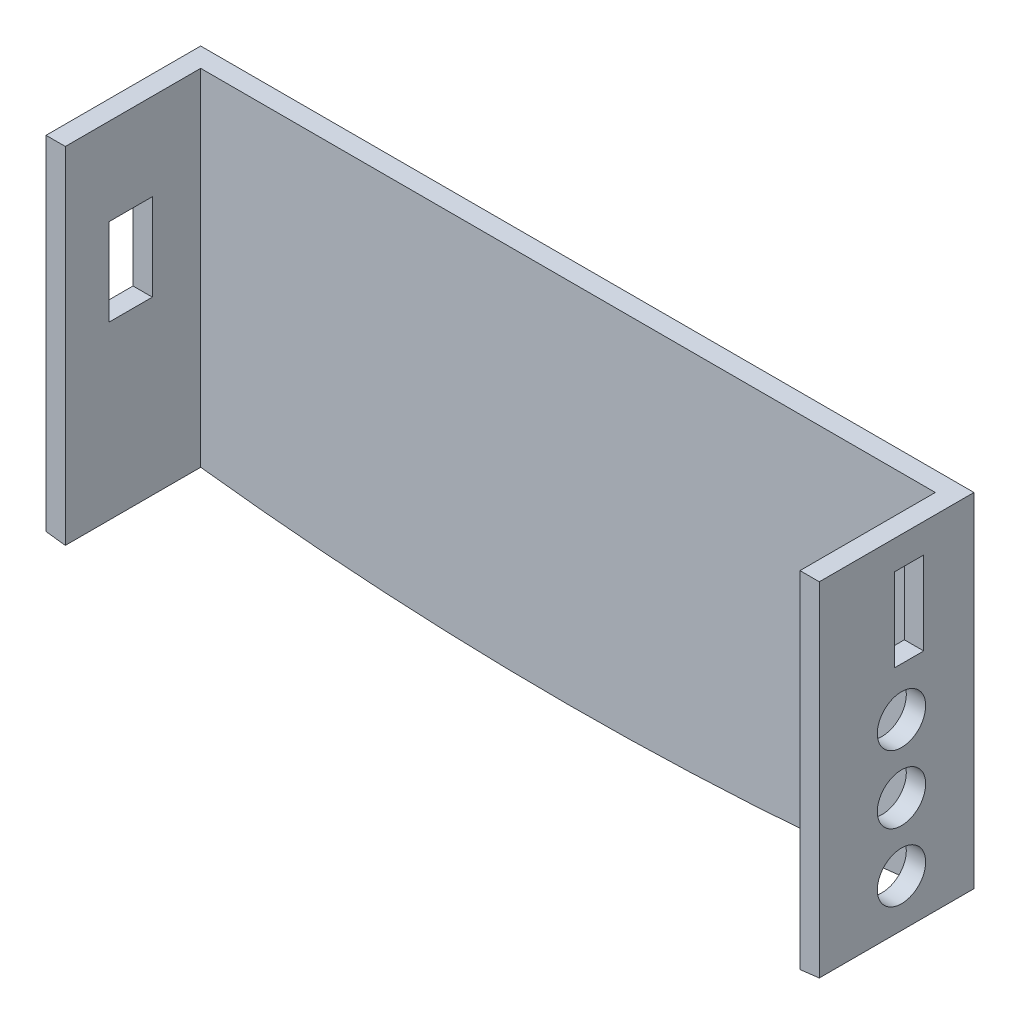
ISO-10303-21;
HEADER;
FILE_DESCRIPTION(('STEP AP214'),'2;1');
FILE_NAME('part.step','',(''),(''),'','','');
FILE_SCHEMA(('AUTOMOTIVE_DESIGN { 1 0 10303 214 1 1 1 1 }'));
ENDSEC;
DATA;
#1=APPLICATION_CONTEXT('core data for automotive mechanical design processes');
#2=APPLICATION_PROTOCOL_DEFINITION('international standard','automotive_design',2000,#1);
#3=PRODUCT_CONTEXT('',#1,'mechanical');
#4=PRODUCT('Part','Part','',(#3));
#5=PRODUCT_RELATED_PRODUCT_CATEGORY('part','',(#4));
#6=PRODUCT_DEFINITION_FORMATION('','',#4);
#7=PRODUCT_DEFINITION_CONTEXT('part definition',#1,'design');
#8=PRODUCT_DEFINITION('design','',#6,#7);
#9=PRODUCT_DEFINITION_SHAPE('','',#8);
#10=(LENGTH_UNIT() NAMED_UNIT(*) SI_UNIT(.MILLI.,.METRE.));
#11=(NAMED_UNIT(*) PLANE_ANGLE_UNIT() SI_UNIT($,.RADIAN.));
#12=(NAMED_UNIT(*) SI_UNIT($,.STERADIAN.) SOLID_ANGLE_UNIT());
#13=UNCERTAINTY_MEASURE_WITH_UNIT(LENGTH_MEASURE(1.E-05),#10,'distance_accuracy_value','');
#14=(GEOMETRIC_REPRESENTATION_CONTEXT(3) GLOBAL_UNCERTAINTY_ASSIGNED_CONTEXT((#13)) GLOBAL_UNIT_ASSIGNED_CONTEXT((#10,
#11,#12)) REPRESENTATION_CONTEXT('',''));
#15=CARTESIAN_POINT('',(0.,0.,0.));
#16=DIRECTION('',(0.,0.,1.));
#17=DIRECTION('',(1.,0.,0.));
#18=AXIS2_PLACEMENT_3D('',#15,#16,#17);
#19=CARTESIAN_POINT('',(0.,0.,16.));
#20=DIRECTION('',(0.,0.,1.));
#21=DIRECTION('',(1.,0.,0.));
#22=AXIS2_PLACEMENT_3D('',#19,#20,#21);
#23=PLANE('',#22);
#24=CARTESIAN_POINT('',(-50.4205664671253,290.086586920608,16.));
#25=DIRECTION('',(0.,0.,1.));
#26=DIRECTION('',(1.,0.,0.));
#27=AXIS2_PLACEMENT_3D('',#24,#25,#26);
#28=CIRCLE('',#27,321.75);
#29=CARTESIAN_POINT('',(-90.4205664671254,-29.1673284821631,16.));
#30=VERTEX_POINT('',#29);
#31=CARTESIAN_POINT('',(-88.4205664671254,-29.41155470153,16.));
#32=VERTEX_POINT('',#31);
#33=EDGE_CURVE('E312',#30,#32,#28,.T.);
#34=ORIENTED_EDGE('',*,*,#33,.T.);
#35=DIRECTION('',(0.,1.,0.));
#36=VECTOR('',#35,1.);
#37=CARTESIAN_POINT('',(-88.4205664671254,0.,16.));
#38=LINE('',#37,#36);
#39=CARTESIAN_POINT('',(-88.4205664671254,6.33267151783695,16.));
#40=VERTEX_POINT('',#39);
#41=EDGE_CURVE('E294',#32,#40,#38,.T.);
#42=ORIENTED_EDGE('',*,*,#41,.T.);
#43=DIRECTION('',(-1.,0.,0.));
#44=VECTOR('',#43,1.);
#45=CARTESIAN_POINT('',(0.,6.33267151783695,16.));
#46=LINE('',#45,#44);
#47=CARTESIAN_POINT('',(-90.4205664671254,6.33267151783695,16.));
#48=VERTEX_POINT('',#47);
#49=EDGE_CURVE('E319',#40,#48,#46,.T.);
#50=ORIENTED_EDGE('',*,*,#49,.T.);
#51=DIRECTION('',(0.,1.,0.));
#52=VECTOR('',#51,1.);
#53=CARTESIAN_POINT('',(-90.4205664671254,0.,16.));
#54=LINE('',#53,#52);
#55=EDGE_CURVE('E306',#30,#48,#54,.T.);
#56=ORIENTED_EDGE('',*,*,#55,.F.);
#57=EDGE_LOOP('',(#34,#42,#50,#56));
#58=FACE_BOUND('',#57,.T.);
#59=ADVANCED_FACE('F44',(#58),#23,.T.);
#60=CARTESIAN_POINT('',(-90.4205664671254,0.,16.));
#61=DIRECTION('',(-1.,0.,0.));
#62=DIRECTION('',(0.,0.,1.));
#63=AXIS2_PLACEMENT_3D('',#60,#61,#62);
#64=PLANE('',#63);
#65=DIRECTION('',(0.,-1.,0.));
#66=VECTOR('',#65,1.);
#67=CARTESIAN_POINT('',(-90.4205664671254,-2.66732848216305,7.));
#68=LINE('',#67,#66);
#69=CARTESIAN_POINT('',(-90.4205664671254,-2.66732848216305,7.));
#70=VERTEX_POINT('',#69);
#71=CARTESIAN_POINT('',(-90.4205664671254,-11.6673284821631,7.));
#72=VERTEX_POINT('',#71);
#73=EDGE_CURVE('E238',#70,#72,#68,.T.);
#74=ORIENTED_EDGE('',*,*,#73,.F.);
#75=DIRECTION('',(0.,0.,-1.));
#76=VECTOR('',#75,1.);
#77=CARTESIAN_POINT('',(-90.4205664671254,-2.66732848216305,7.));
#78=LINE('',#77,#76);
#79=CARTESIAN_POINT('',(-90.4205664671254,-2.66732848216305,11.5));
#80=VERTEX_POINT('',#79);
#81=EDGE_CURVE('E249',#80,#70,#78,.T.);
#82=ORIENTED_EDGE('',*,*,#81,.F.);
#83=DIRECTION('',(0.,1.,0.));
#84=VECTOR('',#83,1.);
#85=CARTESIAN_POINT('',(-90.4205664671254,-2.66732848216305,11.5));
#86=LINE('',#85,#84);
#87=CARTESIAN_POINT('',(-90.4205664671254,-11.6673284821631,11.5));
#88=VERTEX_POINT('',#87);
#89=EDGE_CURVE('E245',#88,#80,#86,.T.);
#90=ORIENTED_EDGE('',*,*,#89,.F.);
#91=DIRECTION('',(0.,0.,1.));
#92=VECTOR('',#91,1.);
#93=CARTESIAN_POINT('',(-90.4205664671254,-11.6673284821631,7.));
#94=LINE('',#93,#92);
#95=EDGE_CURVE('E241',#72,#88,#94,.T.);
#96=ORIENTED_EDGE('',*,*,#95,.F.);
#97=EDGE_LOOP('',(#74,#82,#90,#96));
#98=FACE_BOUND('',#97,.T.);
#99=DIRECTION('',(0.,1.,0.));
#100=VECTOR('',#99,1.);
#101=CARTESIAN_POINT('',(-90.4205664671254,0.,0.));
#102=LINE('',#101,#100);
#103=CARTESIAN_POINT('',(-90.4205664671254,-29.1673284821631,0.));
#104=VERTEX_POINT('',#103);
#105=CARTESIAN_POINT('',(-90.4205664671254,6.33267151783695,0.));
#106=VERTEX_POINT('',#105);
#107=EDGE_CURVE('E282',#104,#106,#102,.T.);
#108=ORIENTED_EDGE('',*,*,#107,.F.);
#109=DIRECTION('',(0.,0.,-1.));
#110=VECTOR('',#109,1.);
#111=CARTESIAN_POINT('',(-90.4205664671254,-29.1673284821631,16.));
#112=LINE('',#111,#110);
#113=EDGE_CURVE('E11',#30,#104,#112,.T.);
#114=ORIENTED_EDGE('',*,*,#113,.F.);
#115=ORIENTED_EDGE('',*,*,#55,.T.);
#116=DIRECTION('',(0.,0.,-1.));
#117=VECTOR('',#116,1.);
#118=CARTESIAN_POINT('',(-90.4205664671254,6.33267151783695,16.));
#119=LINE('',#118,#117);
#120=EDGE_CURVE('E324',#48,#106,#119,.T.);
#121=ORIENTED_EDGE('',*,*,#120,.T.);
#122=EDGE_LOOP('',(#108,#114,#115,#121));
#123=FACE_BOUND('',#122,.T.);
#124=ADVANCED_FACE('F46',(#98,#123),#64,.T.);
#125=CARTESIAN_POINT('',(-50.4205664671253,290.086586920608,16.));
#126=DIRECTION('',(0.,0.,-1.));
#127=DIRECTION('',(-1.,0.,0.));
#128=AXIS2_PLACEMENT_3D('',#125,#126,#127);
#129=CYLINDRICAL_SURFACE('',#128,321.75);
#130=CARTESIAN_POINT('',(-12.4205664671254,-29.41155470153,16.));
#131=VERTEX_POINT('',#130);
#132=CARTESIAN_POINT('',(-10.4205664671254,-29.1673284821631,16.));
#133=VERTEX_POINT('',#132);
#134=EDGE_CURVE('E310',#131,#133,#28,.T.);
#135=ORIENTED_EDGE('',*,*,#134,.F.);
#136=DIRECTION('',(0.,0.,-1.));
#137=VECTOR('',#136,1.);
#138=CARTESIAN_POINT('',(-12.4205664671254,-29.41155470153,16.));
#139=LINE('',#138,#137);
#140=CARTESIAN_POINT('',(-12.4205664671254,-29.41155470153,2.));
#141=VERTEX_POINT('',#140);
#142=EDGE_CURVE('E283',#131,#141,#139,.T.);
#143=ORIENTED_EDGE('',*,*,#142,.T.);
#144=CARTESIAN_POINT('',(-50.4205664671253,290.086586920608,2.));
#145=DIRECTION('',(0.,0.,1.));
#146=DIRECTION('',(1.,0.,0.));
#147=AXIS2_PLACEMENT_3D('',#144,#145,#146);
#148=CIRCLE('',#147,321.75);
#149=CARTESIAN_POINT('',(-88.4205664671254,-29.41155470153,2.));
#150=VERTEX_POINT('',#149);
#151=EDGE_CURVE('E274',#150,#141,#148,.T.);
#152=ORIENTED_EDGE('',*,*,#151,.F.);
#153=DIRECTION('',(0.,0.,-1.));
#154=VECTOR('',#153,1.);
#155=CARTESIAN_POINT('',(-88.4205664671254,-29.41155470153,16.));
#156=LINE('',#155,#154);
#157=EDGE_CURVE('E279',#32,#150,#156,.T.);
#158=ORIENTED_EDGE('',*,*,#157,.F.);
#159=ORIENTED_EDGE('',*,*,#33,.F.);
#160=ORIENTED_EDGE('',*,*,#113,.T.);
#161=CARTESIAN_POINT('',(-50.4205664671253,290.086586920608,0.));
#162=DIRECTION('',(0.,0.,1.));
#163=DIRECTION('',(1.,0.,0.));
#164=AXIS2_PLACEMENT_3D('',#161,#162,#163);
#165=CIRCLE('',#164,321.75);
#166=CARTESIAN_POINT('',(-10.4205664671254,-29.1673284821631,0.));
#167=VERTEX_POINT('',#166);
#168=EDGE_CURVE('E328',#104,#167,#165,.T.);
#169=ORIENTED_EDGE('',*,*,#168,.T.);
#170=DIRECTION('',(0.,0.,-1.));
#171=VECTOR('',#170,1.);
#172=CARTESIAN_POINT('',(-10.4205664671254,-29.1673284821631,16.));
#173=LINE('',#172,#171);
#174=EDGE_CURVE('E53',#133,#167,#173,.T.);
#175=ORIENTED_EDGE('',*,*,#174,.F.);
#176=EDGE_LOOP('',(#135,#143,#152,#158,#159,#160,#169,#175));
#177=FACE_BOUND('',#176,.T.);
#178=ADVANCED_FACE('F379',(#177),#129,.T.);
#179=CARTESIAN_POINT('',(-10.4205664671254,0.,16.));
#180=DIRECTION('',(-1.,0.,0.));
#181=DIRECTION('',(0.,0.,1.));
#182=AXIS2_PLACEMENT_3D('',#179,#180,#181);
#183=PLANE('',#182);
#184=DIRECTION('',(0.,0.,-1.));
#185=VECTOR('',#184,1.);
#186=CARTESIAN_POINT('',(-10.4205664671254,-5.26732848216305,8.2));
#187=LINE('',#186,#185);
#188=CARTESIAN_POINT('',(-10.4205664671254,-5.26732848216305,8.2));
#189=VERTEX_POINT('',#188);
#190=CARTESIAN_POINT('',(-10.4205664671254,-5.26732848216305,5.2));
#191=VERTEX_POINT('',#190);
#192=EDGE_CURVE('E60',#189,#191,#187,.T.);
#193=ORIENTED_EDGE('',*,*,#192,.F.);
#194=DIRECTION('',(0.,-1.,0.));
#195=VECTOR('',#194,1.);
#196=CARTESIAN_POINT('',(-10.4205664671254,3.33267151783695,8.2));
#197=LINE('',#196,#195);
#198=CARTESIAN_POINT('',(-10.4205664671254,3.33267151783695,8.2));
#199=VERTEX_POINT('',#198);
#200=EDGE_CURVE('E192',#199,#189,#197,.T.);
#201=ORIENTED_EDGE('',*,*,#200,.F.);
#202=DIRECTION('',(0.,0.,1.));
#203=VECTOR('',#202,1.);
#204=CARTESIAN_POINT('',(-10.4205664671254,3.33267151783695,8.2));
#205=LINE('',#204,#203);
#206=CARTESIAN_POINT('',(-10.4205664671254,3.33267151783695,5.2));
#207=VERTEX_POINT('',#206);
#208=EDGE_CURVE('E182',#207,#199,#205,.T.);
#209=ORIENTED_EDGE('',*,*,#208,.F.);
#210=DIRECTION('',(0.,1.,0.));
#211=VECTOR('',#210,1.);
#212=CARTESIAN_POINT('',(-10.4205664671254,3.33267151783695,5.2));
#213=LINE('',#212,#211);
#214=EDGE_CURVE('E187',#191,#207,#213,.T.);
#215=ORIENTED_EDGE('',*,*,#214,.F.);
#216=EDGE_LOOP('',(#193,#201,#209,#215));
#217=FACE_BOUND('',#216,.T.);
#218=CARTESIAN_POINT('',(-10.4205664671254,-10.2673284821631,7.5));
#219=DIRECTION('',(1.,0.,0.));
#220=DIRECTION('',(0.,0.,-1.));
#221=AXIS2_PLACEMENT_3D('',#218,#219,#220);
#222=CIRCLE('',#221,2.5);
#223=CARTESIAN_POINT('',(-10.4205664671254,-10.2673284821631,5.));
#224=VERTEX_POINT('',#223);
#225=EDGE_CURVE('E205',#224,#224,#222,.T.);
#226=ORIENTED_EDGE('',*,*,#225,.F.);
#227=EDGE_LOOP('',(#226));
#228=FACE_BOUND('',#227,.T.);
#229=CARTESIAN_POINT('',(-10.4205664671254,-17.2673284821631,7.5));
#230=DIRECTION('',(1.,0.,0.));
#231=DIRECTION('',(0.,0.,-1.));
#232=AXIS2_PLACEMENT_3D('',#229,#230,#231);
#233=CIRCLE('',#232,2.5);
#234=CARTESIAN_POINT('',(-10.4205664671254,-17.2673284821631,5.));
#235=VERTEX_POINT('',#234);
#236=EDGE_CURVE('E209',#235,#235,#233,.T.);
#237=ORIENTED_EDGE('',*,*,#236,.F.);
#238=EDGE_LOOP('',(#237));
#239=FACE_BOUND('',#238,.T.);
#240=CARTESIAN_POINT('',(-10.4205664671254,-24.2673284821631,7.5));
#241=DIRECTION('',(1.,0.,0.));
#242=DIRECTION('',(0.,0.,-1.));
#243=AXIS2_PLACEMENT_3D('',#240,#241,#242);
#244=CIRCLE('',#243,2.5);
#245=CARTESIAN_POINT('',(-10.4205664671254,-24.2673284821631,5.));
#246=VERTEX_POINT('',#245);
#247=EDGE_CURVE('E220',#246,#246,#244,.T.);
#248=ORIENTED_EDGE('',*,*,#247,.F.);
#249=EDGE_LOOP('',(#248));
#250=FACE_BOUND('',#249,.T.);
#251=DIRECTION('',(0.,1.,0.));
#252=VECTOR('',#251,1.);
#253=CARTESIAN_POINT('',(-10.4205664671254,0.,0.));
#254=LINE('',#253,#252);
#255=CARTESIAN_POINT('',(-10.4205664671254,6.33267151783695,0.));
#256=VERTEX_POINT('',#255);
#257=EDGE_CURVE('E331',#167,#256,#254,.T.);
#258=ORIENTED_EDGE('',*,*,#257,.T.);
#259=DIRECTION('',(0.,0.,-1.));
#260=VECTOR('',#259,1.);
#261=CARTESIAN_POINT('',(-10.4205664671254,6.33267151783695,16.));
#262=LINE('',#261,#260);
#263=CARTESIAN_POINT('',(-10.4205664671254,6.33267151783695,16.));
#264=VERTEX_POINT('',#263);
#265=EDGE_CURVE('E339',#264,#256,#262,.T.);
#266=ORIENTED_EDGE('',*,*,#265,.F.);
#267=DIRECTION('',(0.,1.,0.));
#268=VECTOR('',#267,1.);
#269=CARTESIAN_POINT('',(-10.4205664671254,0.,16.));
#270=LINE('',#269,#268);
#271=EDGE_CURVE('E316',#133,#264,#270,.T.);
#272=ORIENTED_EDGE('',*,*,#271,.F.);
#273=ORIENTED_EDGE('',*,*,#174,.T.);
#274=EDGE_LOOP('',(#258,#266,#272,#273));
#275=FACE_BOUND('',#274,.T.);
#276=ADVANCED_FACE('F348',(#217,#228,#239,#250,#275),#183,.F.);
#277=CARTESIAN_POINT('',(0.,6.33267151783695,16.));
#278=DIRECTION('',(0.,-1.,0.));
#279=DIRECTION('',(0.,0.,-1.));
#280=AXIS2_PLACEMENT_3D('',#277,#278,#279);
#281=PLANE('',#280);
#282=ORIENTED_EDGE('',*,*,#49,.F.);
#283=DIRECTION('',(0.,0.,-1.));
#284=VECTOR('',#283,1.);
#285=CARTESIAN_POINT('',(-88.4205664671254,6.33267151783695,16.));
#286=LINE('',#285,#284);
#287=CARTESIAN_POINT('',(-88.4205664671254,6.33267151783695,2.));
#288=VERTEX_POINT('',#287);
#289=EDGE_CURVE('E293',#40,#288,#286,.T.);
#290=ORIENTED_EDGE('',*,*,#289,.T.);
#291=DIRECTION('',(-1.,0.,0.));
#292=VECTOR('',#291,1.);
#293=CARTESIAN_POINT('',(0.,6.33267151783695,2.));
#294=LINE('',#293,#292);
#295=CARTESIAN_POINT('',(-12.4205664671254,6.33267151783695,2.));
#296=VERTEX_POINT('',#295);
#297=EDGE_CURVE('E278',#296,#288,#294,.T.);
#298=ORIENTED_EDGE('',*,*,#297,.F.);
#299=DIRECTION('',(0.,0.,-1.));
#300=VECTOR('',#299,1.);
#301=CARTESIAN_POINT('',(-12.4205664671254,6.33267151783695,16.));
#302=LINE('',#301,#300);
#303=CARTESIAN_POINT('',(-12.4205664671254,6.33267151783695,16.));
#304=VERTEX_POINT('',#303);
#305=EDGE_CURVE('E289',#304,#296,#302,.T.);
#306=ORIENTED_EDGE('',*,*,#305,.F.);
#307=EDGE_CURVE('E320',#264,#304,#46,.T.);
#308=ORIENTED_EDGE('',*,*,#307,.F.);
#309=ORIENTED_EDGE('',*,*,#265,.T.);
#310=DIRECTION('',(-1.,0.,0.));
#311=VECTOR('',#310,1.);
#312=CARTESIAN_POINT('',(0.,6.33267151783695,0.));
#313=LINE('',#312,#311);
#314=EDGE_CURVE('E311',#256,#106,#313,.T.);
#315=ORIENTED_EDGE('',*,*,#314,.T.);
#316=ORIENTED_EDGE('',*,*,#120,.F.);
#317=EDGE_LOOP('',(#282,#290,#298,#306,#308,#309,#315,#316));
#318=FACE_BOUND('',#317,.T.);
#319=ADVANCED_FACE('F360',(#318),#281,.F.);
#320=DIRECTION('',(0.,1.,0.));
#321=VECTOR('',#320,1.);
#322=CARTESIAN_POINT('',(-12.4205664671254,0.,16.));
#323=LINE('',#322,#321);
#324=EDGE_CURVE('E290',#131,#304,#323,.T.);
#325=ORIENTED_EDGE('',*,*,#324,.F.);
#326=ORIENTED_EDGE('',*,*,#134,.T.);
#327=ORIENTED_EDGE('',*,*,#271,.T.);
#328=ORIENTED_EDGE('',*,*,#307,.T.);
#329=EDGE_LOOP('',(#325,#326,#327,#328));
#330=FACE_BOUND('',#329,.T.);
#331=ADVANCED_FACE('F366',(#330),#23,.T.);
#332=CARTESIAN_POINT('',(0.,0.,0.));
#333=DIRECTION('',(0.,0.,1.));
#334=DIRECTION('',(1.,0.,0.));
#335=AXIS2_PLACEMENT_3D('',#332,#333,#334);
#336=PLANE('',#335);
#337=ORIENTED_EDGE('',*,*,#107,.T.);
#338=ORIENTED_EDGE('',*,*,#314,.F.);
#339=ORIENTED_EDGE('',*,*,#257,.F.);
#340=ORIENTED_EDGE('',*,*,#168,.F.);
#341=EDGE_LOOP('',(#337,#338,#339,#340));
#342=FACE_BOUND('',#341,.T.);
#343=ADVANCED_FACE('F355',(#342),#336,.F.);
#344=CARTESIAN_POINT('',(-88.4205664671254,0.,16.));
#345=DIRECTION('',(-1.,0.,0.));
#346=DIRECTION('',(0.,0.,1.));
#347=AXIS2_PLACEMENT_3D('',#344,#345,#346);
#348=PLANE('',#347);
#349=DIRECTION('',(0.,0.,1.));
#350=VECTOR('',#349,1.);
#351=CARTESIAN_POINT('',(-88.4205664671254,-2.66732848216305,7.));
#352=LINE('',#351,#350);
#353=CARTESIAN_POINT('',(-88.4205664671254,-2.66732848216305,7.));
#354=VERTEX_POINT('',#353);
#355=CARTESIAN_POINT('',(-88.4205664671254,-2.66732848216305,11.5));
#356=VERTEX_POINT('',#355);
#357=EDGE_CURVE('E230',#354,#356,#352,.T.);
#358=ORIENTED_EDGE('',*,*,#357,.F.);
#359=DIRECTION('',(0.,1.,0.));
#360=VECTOR('',#359,1.);
#361=CARTESIAN_POINT('',(-88.4205664671254,-2.66732848216305,7.));
#362=LINE('',#361,#360);
#363=CARTESIAN_POINT('',(-88.4205664671254,-11.6673284821631,7.));
#364=VERTEX_POINT('',#363);
#365=EDGE_CURVE('E234',#364,#354,#362,.T.);
#366=ORIENTED_EDGE('',*,*,#365,.F.);
#367=DIRECTION('',(0.,0.,-1.));
#368=VECTOR('',#367,1.);
#369=CARTESIAN_POINT('',(-88.4205664671254,-11.6673284821631,7.));
#370=LINE('',#369,#368);
#371=CARTESIAN_POINT('',(-88.4205664671254,-11.6673284821631,11.5));
#372=VERTEX_POINT('',#371);
#373=EDGE_CURVE('E257',#372,#364,#370,.T.);
#374=ORIENTED_EDGE('',*,*,#373,.F.);
#375=DIRECTION('',(0.,-1.,0.));
#376=VECTOR('',#375,1.);
#377=CARTESIAN_POINT('',(-88.4205664671254,-2.66732848216305,11.5));
#378=LINE('',#377,#376);
#379=EDGE_CURVE('E186',#356,#372,#378,.T.);
#380=ORIENTED_EDGE('',*,*,#379,.F.);
#381=EDGE_LOOP('',(#358,#366,#374,#380));
#382=FACE_BOUND('',#381,.T.);
#383=DIRECTION('',(0.,1.,0.));
#384=VECTOR('',#383,1.);
#385=CARTESIAN_POINT('',(-88.4205664671254,0.,2.));
#386=LINE('',#385,#384);
#387=EDGE_CURVE('E270',#150,#288,#386,.T.);
#388=ORIENTED_EDGE('',*,*,#387,.T.);
#389=ORIENTED_EDGE('',*,*,#289,.F.);
#390=ORIENTED_EDGE('',*,*,#41,.F.);
#391=ORIENTED_EDGE('',*,*,#157,.T.);
#392=EDGE_LOOP('',(#388,#389,#390,#391));
#393=FACE_BOUND('',#392,.T.);
#394=ADVANCED_FACE('F372',(#382,#393),#348,.F.);
#395=CARTESIAN_POINT('',(-12.4205664671254,0.,16.));
#396=DIRECTION('',(-1.,0.,0.));
#397=DIRECTION('',(0.,0.,1.));
#398=AXIS2_PLACEMENT_3D('',#395,#396,#397);
#399=PLANE('',#398);
#400=DIRECTION('',(0.,-1.,0.));
#401=VECTOR('',#400,1.);
#402=CARTESIAN_POINT('',(-12.4205664671254,3.33267151783695,8.2));
#403=LINE('',#402,#401);
#404=CARTESIAN_POINT('',(-12.4205664671254,3.33267151783695,8.2));
#405=VERTEX_POINT('',#404);
#406=CARTESIAN_POINT('',(-12.4205664671254,-5.26732848216305,8.2));
#407=VERTEX_POINT('',#406);
#408=EDGE_CURVE('E175',#405,#407,#403,.T.);
#409=ORIENTED_EDGE('',*,*,#408,.T.);
#410=DIRECTION('',(0.,0.,-1.));
#411=VECTOR('',#410,1.);
#412=CARTESIAN_POINT('',(-12.4205664671254,-5.26732848216305,8.2));
#413=LINE('',#412,#411);
#414=CARTESIAN_POINT('',(-12.4205664671254,-5.26732848216305,5.2));
#415=VERTEX_POINT('',#414);
#416=EDGE_CURVE('E167',#407,#415,#413,.T.);
#417=ORIENTED_EDGE('',*,*,#416,.T.);
#418=DIRECTION('',(0.,1.,0.));
#419=VECTOR('',#418,1.);
#420=CARTESIAN_POINT('',(-12.4205664671254,3.33267151783695,5.2));
#421=LINE('',#420,#419);
#422=CARTESIAN_POINT('',(-12.4205664671254,3.33267151783695,5.2));
#423=VERTEX_POINT('',#422);
#424=EDGE_CURVE('E156',#415,#423,#421,.T.);
#425=ORIENTED_EDGE('',*,*,#424,.T.);
#426=DIRECTION('',(0.,0.,1.));
#427=VECTOR('',#426,1.);
#428=CARTESIAN_POINT('',(-12.4205664671254,3.33267151783695,8.2));
#429=LINE('',#428,#427);
#430=EDGE_CURVE('E170',#423,#405,#429,.T.);
#431=ORIENTED_EDGE('',*,*,#430,.T.);
#432=EDGE_LOOP('',(#409,#417,#425,#431));
#433=FACE_BOUND('',#432,.T.);
#434=CARTESIAN_POINT('',(-12.4205664671254,-10.2673284821631,7.5));
#435=DIRECTION('',(-1.,0.,0.));
#436=DIRECTION('',(0.,0.,1.));
#437=AXIS2_PLACEMENT_3D('',#434,#435,#436);
#438=CIRCLE('',#437,2.5);
#439=CARTESIAN_POINT('',(-12.4205664671254,-10.2673284821631,10.));
#440=VERTEX_POINT('',#439);
#441=EDGE_CURVE('E198',#440,#440,#438,.F.);
#442=ORIENTED_EDGE('',*,*,#441,.T.);
#443=EDGE_LOOP('',(#442));
#444=FACE_BOUND('',#443,.T.);
#445=CARTESIAN_POINT('',(-12.4205664671254,-17.2673284821631,7.5));
#446=DIRECTION('',(-1.,0.,0.));
#447=DIRECTION('',(0.,0.,1.));
#448=AXIS2_PLACEMENT_3D('',#445,#446,#447);
#449=CIRCLE('',#448,2.5);
#450=CARTESIAN_POINT('',(-12.4205664671254,-17.2673284821631,10.));
#451=VERTEX_POINT('',#450);
#452=EDGE_CURVE('E216',#451,#451,#449,.F.);
#453=ORIENTED_EDGE('',*,*,#452,.T.);
#454=EDGE_LOOP('',(#453));
#455=FACE_BOUND('',#454,.T.);
#456=CARTESIAN_POINT('',(-12.4205664671254,-24.2673284821631,7.5));
#457=DIRECTION('',(-1.,0.,0.));
#458=DIRECTION('',(0.,0.,1.));
#459=AXIS2_PLACEMENT_3D('',#456,#457,#458);
#460=CIRCLE('',#459,2.5);
#461=CARTESIAN_POINT('',(-12.4205664671254,-24.2673284821631,10.));
#462=VERTEX_POINT('',#461);
#463=EDGE_CURVE('E224',#462,#462,#460,.F.);
#464=ORIENTED_EDGE('',*,*,#463,.T.);
#465=EDGE_LOOP('',(#464));
#466=FACE_BOUND('',#465,.T.);
#467=DIRECTION('',(0.,1.,0.));
#468=VECTOR('',#467,1.);
#469=CARTESIAN_POINT('',(-12.4205664671254,0.,2.));
#470=LINE('',#469,#468);
#471=EDGE_CURVE('E275',#141,#296,#470,.T.);
#472=ORIENTED_EDGE('',*,*,#471,.F.);
#473=ORIENTED_EDGE('',*,*,#142,.F.);
#474=ORIENTED_EDGE('',*,*,#324,.T.);
#475=ORIENTED_EDGE('',*,*,#305,.T.);
#476=EDGE_LOOP('',(#472,#473,#474,#475));
#477=FACE_BOUND('',#476,.T.);
#478=ADVANCED_FACE('F173',(#433,#444,#455,#466,#477),#399,.T.);
#479=CARTESIAN_POINT('',(0.,0.,2.));
#480=DIRECTION('',(0.,0.,1.));
#481=DIRECTION('',(1.,0.,0.));
#482=AXIS2_PLACEMENT_3D('',#479,#480,#481);
#483=PLANE('',#482);
#484=ORIENTED_EDGE('',*,*,#387,.F.);
#485=ORIENTED_EDGE('',*,*,#151,.T.);
#486=ORIENTED_EDGE('',*,*,#471,.T.);
#487=ORIENTED_EDGE('',*,*,#297,.T.);
#488=EDGE_LOOP('',(#484,#485,#486,#487));
#489=FACE_BOUND('',#488,.T.);
#490=ADVANCED_FACE('F377',(#489),#483,.T.);
#491=CARTESIAN_POINT('',(-10.4195664671254,-2.66732848216305,7.));
#492=DIRECTION('',(0.,0.,-1.));
#493=DIRECTION('',(0.,1.,0.));
#494=AXIS2_PLACEMENT_3D('',#491,#492,#493);
#495=PLANE('',#494);
#496=ORIENTED_EDGE('',*,*,#365,.T.);
#497=DIRECTION('',(-1.,0.,0.));
#498=VECTOR('',#497,1.);
#499=CARTESIAN_POINT('',(-10.4195664671254,-2.66732848216305,7.));
#500=LINE('',#499,#498);
#501=EDGE_CURVE('E254',#354,#70,#500,.T.);
#502=ORIENTED_EDGE('',*,*,#501,.T.);
#503=ORIENTED_EDGE('',*,*,#73,.T.);
#504=DIRECTION('',(-1.,0.,0.));
#505=VECTOR('',#504,1.);
#506=CARTESIAN_POINT('',(-10.4195664671254,-11.6673284821631,7.));
#507=LINE('',#506,#505);
#508=EDGE_CURVE('E253',#364,#72,#507,.T.);
#509=ORIENTED_EDGE('',*,*,#508,.F.);
#510=EDGE_LOOP('',(#496,#502,#503,#509));
#511=FACE_BOUND('',#510,.T.);
#512=ADVANCED_FACE('F388',(#511),#495,.F.);
#513=CARTESIAN_POINT('',(-10.4195664671254,-2.66732848216305,7.));
#514=DIRECTION('',(0.,1.,0.));
#515=DIRECTION('',(0.,0.,1.));
#516=AXIS2_PLACEMENT_3D('',#513,#514,#515);
#517=PLANE('',#516);
#518=ORIENTED_EDGE('',*,*,#357,.T.);
#519=DIRECTION('',(-1.,0.,0.));
#520=VECTOR('',#519,1.);
#521=CARTESIAN_POINT('',(-10.4195664671254,-2.66732848216305,11.5));
#522=LINE('',#521,#520);
#523=EDGE_CURVE('E258',#356,#80,#522,.T.);
#524=ORIENTED_EDGE('',*,*,#523,.T.);
#525=ORIENTED_EDGE('',*,*,#81,.T.);
#526=ORIENTED_EDGE('',*,*,#501,.F.);
#527=EDGE_LOOP('',(#518,#524,#525,#526));
#528=FACE_BOUND('',#527,.T.);
#529=ADVANCED_FACE('F530',(#528),#517,.F.);
#530=CARTESIAN_POINT('',(-10.4195664671254,-2.66732848216305,11.5));
#531=DIRECTION('',(0.,0.,1.));
#532=DIRECTION('',(0.,-1.,0.));
#533=AXIS2_PLACEMENT_3D('',#530,#531,#532);
#534=PLANE('',#533);
#535=ORIENTED_EDGE('',*,*,#379,.T.);
#536=DIRECTION('',(-1.,0.,0.));
#537=VECTOR('',#536,1.);
#538=CARTESIAN_POINT('',(-10.4195664671254,-11.6673284821631,11.5));
#539=LINE('',#538,#537);
#540=EDGE_CURVE('E261',#372,#88,#539,.T.);
#541=ORIENTED_EDGE('',*,*,#540,.T.);
#542=ORIENTED_EDGE('',*,*,#89,.T.);
#543=ORIENTED_EDGE('',*,*,#523,.F.);
#544=EDGE_LOOP('',(#535,#541,#542,#543));
#545=FACE_BOUND('',#544,.T.);
#546=ADVANCED_FACE('F521',(#545),#534,.F.);
#547=CARTESIAN_POINT('',(-10.4195664671254,-11.6673284821631,7.));
#548=DIRECTION('',(0.,-1.,0.));
#549=DIRECTION('',(0.,0.,-1.));
#550=AXIS2_PLACEMENT_3D('',#547,#548,#549);
#551=PLANE('',#550);
#552=ORIENTED_EDGE('',*,*,#373,.T.);
#553=ORIENTED_EDGE('',*,*,#508,.T.);
#554=ORIENTED_EDGE('',*,*,#95,.T.);
#555=ORIENTED_EDGE('',*,*,#540,.F.);
#556=EDGE_LOOP('',(#552,#553,#554,#555));
#557=FACE_BOUND('',#556,.T.);
#558=ADVANCED_FACE('F426',(#557),#551,.F.);
#559=CARTESIAN_POINT('',(-90.4215664671254,-24.2673284821631,7.5));
#560=DIRECTION('',(1.,0.,0.));
#561=DIRECTION('',(0.,0.,-1.));
#562=AXIS2_PLACEMENT_3D('',#559,#560,#561);
#563=CYLINDRICAL_SURFACE('',#562,2.5);
#564=ORIENTED_EDGE('',*,*,#463,.F.);
#565=EDGE_LOOP('',(#564));
#566=FACE_BOUND('',#565,.T.);
#567=ORIENTED_EDGE('',*,*,#247,.T.);
#568=EDGE_LOOP('',(#567));
#569=FACE_BOUND('',#568,.T.);
#570=ADVANCED_FACE('F439',(#566,#569),#563,.F.);
#571=CARTESIAN_POINT('',(-90.4215664671254,-17.2673284821631,7.5));
#572=DIRECTION('',(1.,0.,0.));
#573=DIRECTION('',(0.,0.,-1.));
#574=AXIS2_PLACEMENT_3D('',#571,#572,#573);
#575=CYLINDRICAL_SURFACE('',#574,2.5);
#576=ORIENTED_EDGE('',*,*,#452,.F.);
#577=EDGE_LOOP('',(#576));
#578=FACE_BOUND('',#577,.T.);
#579=ORIENTED_EDGE('',*,*,#236,.T.);
#580=EDGE_LOOP('',(#579));
#581=FACE_BOUND('',#580,.T.);
#582=ADVANCED_FACE('F444',(#578,#581),#575,.F.);
#583=CARTESIAN_POINT('',(-90.4215664671254,-10.2673284821631,7.5));
#584=DIRECTION('',(1.,0.,0.));
#585=DIRECTION('',(0.,0.,-1.));
#586=AXIS2_PLACEMENT_3D('',#583,#584,#585);
#587=CYLINDRICAL_SURFACE('',#586,2.5);
#588=ORIENTED_EDGE('',*,*,#441,.F.);
#589=EDGE_LOOP('',(#588));
#590=FACE_BOUND('',#589,.T.);
#591=ORIENTED_EDGE('',*,*,#225,.T.);
#592=EDGE_LOOP('',(#591));
#593=FACE_BOUND('',#592,.T.);
#594=ADVANCED_FACE('F455',(#590,#593),#587,.F.);
#595=CARTESIAN_POINT('',(-90.4215664671254,3.33267151783695,8.2));
#596=DIRECTION('',(0.,0.,1.));
#597=DIRECTION('',(0.,-1.,0.));
#598=AXIS2_PLACEMENT_3D('',#595,#596,#597);
#599=PLANE('',#598);
#600=DIRECTION('',(1.,0.,0.));
#601=VECTOR('',#600,1.);
#602=CARTESIAN_POINT('',(-90.4215664671254,3.33267151783695,8.2));
#603=LINE('',#602,#601);
#604=EDGE_CURVE('E164',#405,#199,#603,.T.);
#605=ORIENTED_EDGE('',*,*,#604,.T.);
#606=ORIENTED_EDGE('',*,*,#200,.T.);
#607=DIRECTION('',(1.,0.,0.));
#608=VECTOR('',#607,1.);
#609=CARTESIAN_POINT('',(-90.4215664671254,-5.26732848216305,8.2));
#610=LINE('',#609,#608);
#611=EDGE_CURVE('E177',#407,#189,#610,.T.);
#612=ORIENTED_EDGE('',*,*,#611,.F.);
#613=ORIENTED_EDGE('',*,*,#408,.F.);
#614=EDGE_LOOP('',(#605,#606,#612,#613));
#615=FACE_BOUND('',#614,.T.);
#616=ADVANCED_FACE('F466',(#615),#599,.F.);
#617=CARTESIAN_POINT('',(-90.4215664671254,-5.26732848216305,8.2));
#618=DIRECTION('',(0.,-1.,0.));
#619=DIRECTION('',(0.,0.,-1.));
#620=AXIS2_PLACEMENT_3D('',#617,#618,#619);
#621=PLANE('',#620);
#622=ORIENTED_EDGE('',*,*,#611,.T.);
#623=ORIENTED_EDGE('',*,*,#192,.T.);
#624=DIRECTION('',(1.,0.,0.));
#625=VECTOR('',#624,1.);
#626=CARTESIAN_POINT('',(-90.4215664671254,-5.26732848216305,5.2));
#627=LINE('',#626,#625);
#628=EDGE_CURVE('E158',#415,#191,#627,.T.);
#629=ORIENTED_EDGE('',*,*,#628,.F.);
#630=ORIENTED_EDGE('',*,*,#416,.F.);
#631=EDGE_LOOP('',(#622,#623,#629,#630));
#632=FACE_BOUND('',#631,.T.);
#633=ADVANCED_FACE('F166',(#632),#621,.F.);
#634=CARTESIAN_POINT('',(-90.4215664671254,3.33267151783695,8.2));
#635=DIRECTION('',(0.,1.,0.));
#636=DIRECTION('',(0.,0.,1.));
#637=AXIS2_PLACEMENT_3D('',#634,#635,#636);
#638=PLANE('',#637);
#639=DIRECTION('',(1.,0.,0.));
#640=VECTOR('',#639,1.);
#641=CARTESIAN_POINT('',(-90.4215664671254,3.33267151783695,5.2));
#642=LINE('',#641,#640);
#643=EDGE_CURVE('E68',#423,#207,#642,.T.);
#644=ORIENTED_EDGE('',*,*,#643,.T.);
#645=ORIENTED_EDGE('',*,*,#208,.T.);
#646=ORIENTED_EDGE('',*,*,#604,.F.);
#647=ORIENTED_EDGE('',*,*,#430,.F.);
#648=EDGE_LOOP('',(#644,#645,#646,#647));
#649=FACE_BOUND('',#648,.T.);
#650=ADVANCED_FACE('F487',(#649),#638,.F.);
#651=CARTESIAN_POINT('',(-90.4215664671254,3.33267151783695,5.2));
#652=DIRECTION('',(0.,0.,-1.));
#653=DIRECTION('',(0.,1.,0.));
#654=AXIS2_PLACEMENT_3D('',#651,#652,#653);
#655=PLANE('',#654);
#656=ORIENTED_EDGE('',*,*,#628,.T.);
#657=ORIENTED_EDGE('',*,*,#214,.T.);
#658=ORIENTED_EDGE('',*,*,#643,.F.);
#659=ORIENTED_EDGE('',*,*,#424,.F.);
#660=EDGE_LOOP('',(#656,#657,#658,#659));
#661=FACE_BOUND('',#660,.T.);
#662=ADVANCED_FACE('F157',(#661),#655,.F.);
#663=CLOSED_SHELL('',(#59,#124,#178,#276,#319,#331,#343,#394,#478,#490,#512,#529,#546,#558,#570,
#582,#594,#616,#633,#650,#662));
#664=MANIFOLD_SOLID_BREP('B2',#663);
#665=ADVANCED_BREP_SHAPE_REPRESENTATION('',(#18,#664),#14);
#666=SHAPE_DEFINITION_REPRESENTATION(#9,#665);
ENDSEC;
END-ISO-10303-21;
